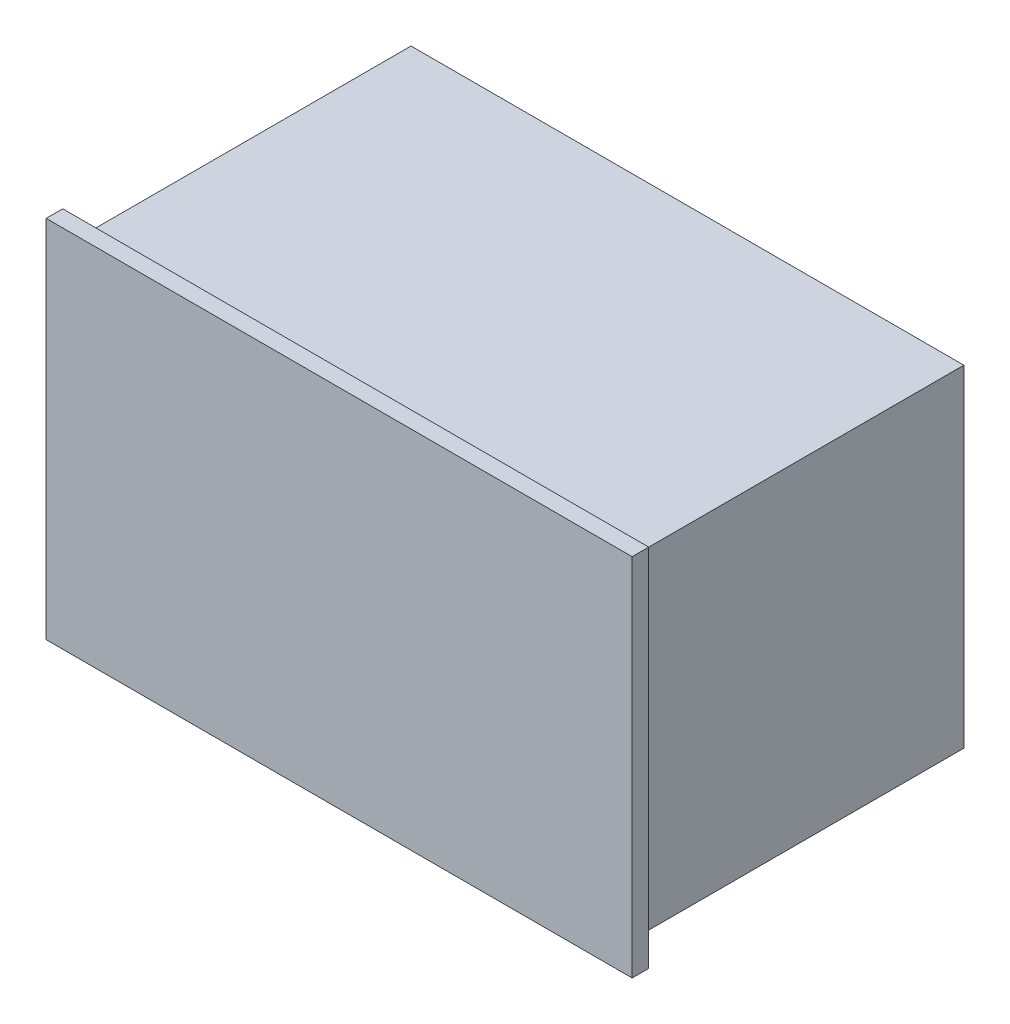
ISO-10303-21;
HEADER;
FILE_DESCRIPTION(('STEP AP214'),'2;1');
FILE_NAME('part.step','',(''),(''),'','','');
FILE_SCHEMA(('AUTOMOTIVE_DESIGN { 1 0 10303 214 1 1 1 1 }'));
ENDSEC;
DATA;
#1=APPLICATION_CONTEXT('core data for automotive mechanical design processes');
#2=APPLICATION_PROTOCOL_DEFINITION('international standard','automotive_design',2000,#1);
#3=PRODUCT_CONTEXT('',#1,'mechanical');
#4=PRODUCT('Part','Part','',(#3));
#5=PRODUCT_RELATED_PRODUCT_CATEGORY('part','',(#4));
#6=PRODUCT_DEFINITION_FORMATION('','',#4);
#7=PRODUCT_DEFINITION_CONTEXT('part definition',#1,'design');
#8=PRODUCT_DEFINITION('design','',#6,#7);
#9=PRODUCT_DEFINITION_SHAPE('','',#8);
#10=(LENGTH_UNIT() NAMED_UNIT(*) SI_UNIT(.MILLI.,.METRE.));
#11=(NAMED_UNIT(*) PLANE_ANGLE_UNIT() SI_UNIT($,.RADIAN.));
#12=(NAMED_UNIT(*) SI_UNIT($,.STERADIAN.) SOLID_ANGLE_UNIT());
#13=UNCERTAINTY_MEASURE_WITH_UNIT(LENGTH_MEASURE(1.E-05),#10,'distance_accuracy_value','');
#14=(GEOMETRIC_REPRESENTATION_CONTEXT(3) GLOBAL_UNCERTAINTY_ASSIGNED_CONTEXT((#13)) GLOBAL_UNIT_ASSIGNED_CONTEXT((#10,
#11,#12)) REPRESENTATION_CONTEXT('',''));
#15=CARTESIAN_POINT('',(0.,0.,0.));
#16=DIRECTION('',(0.,0.,1.));
#17=DIRECTION('',(1.,0.,0.));
#18=AXIS2_PLACEMENT_3D('',#15,#16,#17);
#19=CARTESIAN_POINT('',(0.,0.,60.));
#20=DIRECTION('',(1.,0.,0.));
#21=DIRECTION('',(0.,0.,-1.));
#22=AXIS2_PLACEMENT_3D('',#19,#20,#21);
#23=PLANE('',#22);
#24=DIRECTION('',(0.,-1.,0.));
#25=VECTOR('',#24,1.);
#26=CARTESIAN_POINT('',(0.,0.,0.));
#27=LINE('',#26,#25);
#28=CARTESIAN_POINT('',(0.,60.,0.));
#29=VERTEX_POINT('',#28);
#30=CARTESIAN_POINT('',(0.,0.,0.));
#31=VERTEX_POINT('',#30);
#32=EDGE_CURVE('E202',#29,#31,#27,.T.);
#33=ORIENTED_EDGE('',*,*,#32,.T.);
#34=DIRECTION('',(0.,0.,-1.));
#35=VECTOR('',#34,1.);
#36=CARTESIAN_POINT('',(0.,0.,60.));
#37=LINE('',#36,#35);
#38=CARTESIAN_POINT('',(0.,0.,60.));
#39=VERTEX_POINT('',#38);
#40=EDGE_CURVE('E11',#39,#31,#37,.T.);
#41=ORIENTED_EDGE('',*,*,#40,.F.);
#42=DIRECTION('',(0.,-1.,0.));
#43=VECTOR('',#42,1.);
#44=CARTESIAN_POINT('',(0.,0.,60.));
#45=LINE('',#44,#43);
#46=CARTESIAN_POINT('',(0.,60.,60.));
#47=VERTEX_POINT('',#46);
#48=EDGE_CURVE('E211',#47,#39,#45,.T.);
#49=ORIENTED_EDGE('',*,*,#48,.F.);
#50=DIRECTION('',(0.,0.,-1.));
#51=VECTOR('',#50,1.);
#52=CARTESIAN_POINT('',(0.,60.,60.));
#53=LINE('',#52,#51);
#54=EDGE_CURVE('E221',#47,#29,#53,.T.);
#55=ORIENTED_EDGE('',*,*,#54,.T.);
#56=EDGE_LOOP('',(#33,#41,#49,#55));
#57=FACE_BOUND('',#56,.T.);
#58=ADVANCED_FACE('F35',(#57),#23,.F.);
#59=CARTESIAN_POINT('',(0.,0.,60.));
#60=DIRECTION('',(0.,1.,0.));
#61=DIRECTION('',(0.,0.,1.));
#62=AXIS2_PLACEMENT_3D('',#59,#60,#61);
#63=PLANE('',#62);
#64=CARTESIAN_POINT('',(15.,0.,12.));
#65=DIRECTION('',(0.,-1.,0.));
#66=DIRECTION('',(0.,0.,-1.));
#67=AXIS2_PLACEMENT_3D('',#64,#65,#66);
#68=CIRCLE('',#67,5.5);
#69=CARTESIAN_POINT('',(15.,0.,6.5));
#70=VERTEX_POINT('',#69);
#71=EDGE_CURVE('E169',#70,#70,#68,.T.);
#72=ORIENTED_EDGE('',*,*,#71,.F.);
#73=EDGE_LOOP('',(#72));
#74=FACE_BOUND('',#73,.T.);
#75=CARTESIAN_POINT('',(30.,0.,12.));
#76=DIRECTION('',(0.,-1.,0.));
#77=DIRECTION('',(0.,0.,-1.));
#78=AXIS2_PLACEMENT_3D('',#75,#76,#77);
#79=CIRCLE('',#78,5.5);
#80=CARTESIAN_POINT('',(30.,0.,6.5));
#81=VERTEX_POINT('',#80);
#82=EDGE_CURVE('E160',#81,#81,#79,.T.);
#83=ORIENTED_EDGE('',*,*,#82,.F.);
#84=EDGE_LOOP('',(#83));
#85=FACE_BOUND('',#84,.T.);
#86=DIRECTION('',(1.,0.,0.));
#87=VECTOR('',#86,1.);
#88=CARTESIAN_POINT('',(0.,0.,0.));
#89=LINE('',#88,#87);
#90=CARTESIAN_POINT('',(100.,0.,0.));
#91=VERTEX_POINT('',#90);
#92=EDGE_CURVE('E224',#31,#91,#89,.T.);
#93=ORIENTED_EDGE('',*,*,#92,.T.);
#94=DIRECTION('',(0.,0.,-1.));
#95=VECTOR('',#94,1.);
#96=CARTESIAN_POINT('',(100.,0.,60.));
#97=LINE('',#96,#95);
#98=CARTESIAN_POINT('',(100.,0.,60.));
#99=VERTEX_POINT('',#98);
#100=EDGE_CURVE('E43',#99,#91,#97,.T.);
#101=ORIENTED_EDGE('',*,*,#100,.F.);
#102=DIRECTION('',(1.,0.,0.));
#103=VECTOR('',#102,1.);
#104=CARTESIAN_POINT('',(0.,0.,60.));
#105=LINE('',#104,#103);
#106=EDGE_CURVE('E77',#39,#99,#105,.T.);
#107=ORIENTED_EDGE('',*,*,#106,.F.);
#108=ORIENTED_EDGE('',*,*,#40,.T.);
#109=EDGE_LOOP('',(#93,#101,#107,#108));
#110=FACE_BOUND('',#109,.T.);
#111=ADVANCED_FACE('F269',(#74,#85,#110),#63,.F.);
#112=CARTESIAN_POINT('',(100.,0.,60.));
#113=DIRECTION('',(-1.,0.,0.));
#114=DIRECTION('',(0.,0.,1.));
#115=AXIS2_PLACEMENT_3D('',#112,#113,#114);
#116=PLANE('',#115);
#117=DIRECTION('',(0.,1.,0.));
#118=VECTOR('',#117,1.);
#119=CARTESIAN_POINT('',(100.,0.,0.));
#120=LINE('',#119,#118);
#121=CARTESIAN_POINT('',(100.,60.,0.));
#122=VERTEX_POINT('',#121);
#123=EDGE_CURVE('E67',#91,#122,#120,.T.);
#124=ORIENTED_EDGE('',*,*,#123,.T.);
#125=DIRECTION('',(0.,0.,-1.));
#126=VECTOR('',#125,1.);
#127=CARTESIAN_POINT('',(100.,60.,60.));
#128=LINE('',#127,#126);
#129=CARTESIAN_POINT('',(100.,60.,60.));
#130=VERTEX_POINT('',#129);
#131=EDGE_CURVE('E51',#130,#122,#128,.T.);
#132=ORIENTED_EDGE('',*,*,#131,.F.);
#133=DIRECTION('',(0.,1.,0.));
#134=VECTOR('',#133,1.);
#135=CARTESIAN_POINT('',(100.,0.,60.));
#136=LINE('',#135,#134);
#137=EDGE_CURVE('E215',#99,#130,#136,.T.);
#138=ORIENTED_EDGE('',*,*,#137,.F.);
#139=ORIENTED_EDGE('',*,*,#100,.T.);
#140=EDGE_LOOP('',(#124,#132,#138,#139));
#141=FACE_BOUND('',#140,.T.);
#142=ADVANCED_FACE('F229',(#141),#116,.F.);
#143=CARTESIAN_POINT('',(0.,60.,60.));
#144=DIRECTION('',(0.,-1.,0.));
#145=DIRECTION('',(0.,0.,-1.));
#146=AXIS2_PLACEMENT_3D('',#143,#144,#145);
#147=PLANE('',#146);
#148=DIRECTION('',(-1.,0.,0.));
#149=VECTOR('',#148,1.);
#150=CARTESIAN_POINT('',(0.,60.,0.));
#151=LINE('',#150,#149);
#152=EDGE_CURVE('E72',#122,#29,#151,.T.);
#153=ORIENTED_EDGE('',*,*,#152,.T.);
#154=ORIENTED_EDGE('',*,*,#54,.F.);
#155=DIRECTION('',(-1.,0.,0.));
#156=VECTOR('',#155,1.);
#157=CARTESIAN_POINT('',(0.,60.,60.));
#158=LINE('',#157,#156);
#159=EDGE_CURVE('E218',#130,#47,#158,.T.);
#160=ORIENTED_EDGE('',*,*,#159,.F.);
#161=ORIENTED_EDGE('',*,*,#131,.T.);
#162=EDGE_LOOP('',(#153,#154,#160,#161));
#163=FACE_BOUND('',#162,.T.);
#164=ADVANCED_FACE('F234',(#163),#147,.F.);
#165=CARTESIAN_POINT('',(0.,0.,0.));
#166=DIRECTION('',(0.,0.,-1.));
#167=DIRECTION('',(-1.,0.,0.));
#168=AXIS2_PLACEMENT_3D('',#165,#166,#167);
#169=PLANE('',#168);
#170=ORIENTED_EDGE('',*,*,#32,.F.);
#171=ORIENTED_EDGE('',*,*,#152,.F.);
#172=ORIENTED_EDGE('',*,*,#123,.F.);
#173=ORIENTED_EDGE('',*,*,#92,.F.);
#174=EDGE_LOOP('',(#170,#171,#172,#173));
#175=FACE_BOUND('',#174,.T.);
#176=ADVANCED_FACE('F232',(#175),#169,.T.);
#177=CARTESIAN_POINT('',(3.,3.,3.));
#178=DIRECTION('',(-1.,0.,0.));
#179=DIRECTION('',(0.,0.,1.));
#180=AXIS2_PLACEMENT_3D('',#177,#178,#179);
#181=PLANE('',#180);
#182=DIRECTION('',(0.,-1.,0.));
#183=VECTOR('',#182,1.);
#184=CARTESIAN_POINT('',(3.,3.,60.));
#185=LINE('',#184,#183);
#186=CARTESIAN_POINT('',(3.,57.,60.));
#187=VERTEX_POINT('',#186);
#188=CARTESIAN_POINT('',(3.,3.,60.));
#189=VERTEX_POINT('',#188);
#190=EDGE_CURVE('E171',#187,#189,#185,.T.);
#191=ORIENTED_EDGE('',*,*,#190,.T.);
#192=DIRECTION('',(0.,0.,1.));
#193=VECTOR('',#192,1.);
#194=CARTESIAN_POINT('',(3.,3.,3.));
#195=LINE('',#194,#193);
#196=CARTESIAN_POINT('',(3.,3.,3.));
#197=VERTEX_POINT('',#196);
#198=EDGE_CURVE('E188',#197,#189,#195,.T.);
#199=ORIENTED_EDGE('',*,*,#198,.F.);
#200=DIRECTION('',(0.,-1.,0.));
#201=VECTOR('',#200,1.);
#202=CARTESIAN_POINT('',(3.,3.,3.));
#203=LINE('',#202,#201);
#204=CARTESIAN_POINT('',(3.,57.,3.));
#205=VERTEX_POINT('',#204);
#206=EDGE_CURVE('E175',#205,#197,#203,.T.);
#207=ORIENTED_EDGE('',*,*,#206,.F.);
#208=DIRECTION('',(0.,0.,1.));
#209=VECTOR('',#208,1.);
#210=CARTESIAN_POINT('',(3.,57.,3.));
#211=LINE('',#210,#209);
#212=EDGE_CURVE('E199',#205,#187,#211,.T.);
#213=ORIENTED_EDGE('',*,*,#212,.T.);
#214=EDGE_LOOP('',(#191,#199,#207,#213));
#215=FACE_BOUND('',#214,.T.);
#216=ADVANCED_FACE('F285',(#215),#181,.F.);
#217=CARTESIAN_POINT('',(3.,57.,3.));
#218=DIRECTION('',(0.,1.,0.));
#219=DIRECTION('',(0.,0.,1.));
#220=AXIS2_PLACEMENT_3D('',#217,#218,#219);
#221=PLANE('',#220);
#222=DIRECTION('',(-1.,0.,0.));
#223=VECTOR('',#222,1.);
#224=CARTESIAN_POINT('',(3.,57.,60.));
#225=LINE('',#224,#223);
#226=CARTESIAN_POINT('',(97.,57.,60.));
#227=VERTEX_POINT('',#226);
#228=EDGE_CURVE('E179',#227,#187,#225,.T.);
#229=ORIENTED_EDGE('',*,*,#228,.T.);
#230=ORIENTED_EDGE('',*,*,#212,.F.);
#231=DIRECTION('',(-1.,0.,0.));
#232=VECTOR('',#231,1.);
#233=CARTESIAN_POINT('',(3.,57.,3.));
#234=LINE('',#233,#232);
#235=CARTESIAN_POINT('',(97.,57.,3.));
#236=VERTEX_POINT('',#235);
#237=EDGE_CURVE('E185',#236,#205,#234,.T.);
#238=ORIENTED_EDGE('',*,*,#237,.F.);
#239=DIRECTION('',(0.,0.,1.));
#240=VECTOR('',#239,1.);
#241=CARTESIAN_POINT('',(97.,57.,3.));
#242=LINE('',#241,#240);
#243=EDGE_CURVE('E203',#236,#227,#242,.T.);
#244=ORIENTED_EDGE('',*,*,#243,.T.);
#245=EDGE_LOOP('',(#229,#230,#238,#244));
#246=FACE_BOUND('',#245,.T.);
#247=ADVANCED_FACE('F288',(#246),#221,.F.);
#248=CARTESIAN_POINT('',(97.,3.,3.));
#249=DIRECTION('',(1.,0.,0.));
#250=DIRECTION('',(0.,0.,-1.));
#251=AXIS2_PLACEMENT_3D('',#248,#249,#250);
#252=PLANE('',#251);
#253=DIRECTION('',(0.,1.,0.));
#254=VECTOR('',#253,1.);
#255=CARTESIAN_POINT('',(97.,3.,60.));
#256=LINE('',#255,#254);
#257=CARTESIAN_POINT('',(97.,3.,60.));
#258=VERTEX_POINT('',#257);
#259=EDGE_CURVE('E194',#258,#227,#256,.T.);
#260=ORIENTED_EDGE('',*,*,#259,.T.);
#261=ORIENTED_EDGE('',*,*,#243,.F.);
#262=DIRECTION('',(0.,1.,0.));
#263=VECTOR('',#262,1.);
#264=CARTESIAN_POINT('',(97.,3.,3.));
#265=LINE('',#264,#263);
#266=CARTESIAN_POINT('',(97.,3.,3.));
#267=VERTEX_POINT('',#266);
#268=EDGE_CURVE('E182',#267,#236,#265,.T.);
#269=ORIENTED_EDGE('',*,*,#268,.F.);
#270=DIRECTION('',(0.,0.,1.));
#271=VECTOR('',#270,1.);
#272=CARTESIAN_POINT('',(97.,3.,3.));
#273=LINE('',#272,#271);
#274=EDGE_CURVE('E206',#267,#258,#273,.T.);
#275=ORIENTED_EDGE('',*,*,#274,.T.);
#276=EDGE_LOOP('',(#260,#261,#269,#275));
#277=FACE_BOUND('',#276,.T.);
#278=ADVANCED_FACE('F294',(#277),#252,.F.);
#279=CARTESIAN_POINT('',(3.,3.,3.));
#280=DIRECTION('',(0.,-1.,0.));
#281=DIRECTION('',(0.,0.,-1.));
#282=AXIS2_PLACEMENT_3D('',#279,#280,#281);
#283=PLANE('',#282);
#284=CARTESIAN_POINT('',(15.,3.,12.));
#285=DIRECTION('',(0.,-1.,0.));
#286=DIRECTION('',(0.,0.,-1.));
#287=AXIS2_PLACEMENT_3D('',#284,#285,#286);
#288=CIRCLE('',#287,5.5);
#289=CARTESIAN_POINT('',(15.,3.,6.5));
#290=VERTEX_POINT('',#289);
#291=EDGE_CURVE('E166',#290,#290,#288,.F.);
#292=ORIENTED_EDGE('',*,*,#291,.F.);
#293=EDGE_LOOP('',(#292));
#294=FACE_BOUND('',#293,.T.);
#295=CARTESIAN_POINT('',(30.,3.,12.));
#296=DIRECTION('',(0.,-1.,0.));
#297=DIRECTION('',(0.,0.,-1.));
#298=AXIS2_PLACEMENT_3D('',#295,#296,#297);
#299=CIRCLE('',#298,5.5);
#300=CARTESIAN_POINT('',(30.,3.,6.5));
#301=VERTEX_POINT('',#300);
#302=EDGE_CURVE('E157',#301,#301,#299,.F.);
#303=ORIENTED_EDGE('',*,*,#302,.F.);
#304=EDGE_LOOP('',(#303));
#305=FACE_BOUND('',#304,.T.);
#306=DIRECTION('',(1.,0.,0.));
#307=VECTOR('',#306,1.);
#308=CARTESIAN_POINT('',(3.,3.,60.));
#309=LINE('',#308,#307);
#310=EDGE_CURVE('E191',#189,#258,#309,.T.);
#311=ORIENTED_EDGE('',*,*,#310,.T.);
#312=ORIENTED_EDGE('',*,*,#274,.F.);
#313=DIRECTION('',(1.,0.,0.));
#314=VECTOR('',#313,1.);
#315=CARTESIAN_POINT('',(3.,3.,3.));
#316=LINE('',#315,#314);
#317=EDGE_CURVE('E178',#197,#267,#316,.T.);
#318=ORIENTED_EDGE('',*,*,#317,.F.);
#319=ORIENTED_EDGE('',*,*,#198,.T.);
#320=EDGE_LOOP('',(#311,#312,#318,#319));
#321=FACE_BOUND('',#320,.T.);
#322=ADVANCED_FACE('F290',(#294,#305,#321),#283,.F.);
#323=CARTESIAN_POINT('',(0.,0.,3.));
#324=DIRECTION('',(0.,0.,-1.));
#325=DIRECTION('',(-1.,0.,0.));
#326=AXIS2_PLACEMENT_3D('',#323,#324,#325);
#327=PLANE('',#326);
#328=ORIENTED_EDGE('',*,*,#206,.T.);
#329=ORIENTED_EDGE('',*,*,#317,.T.);
#330=ORIENTED_EDGE('',*,*,#268,.T.);
#331=ORIENTED_EDGE('',*,*,#237,.T.);
#332=EDGE_LOOP('',(#328,#329,#330,#331));
#333=FACE_BOUND('',#332,.T.);
#334=ADVANCED_FACE('F293',(#333),#327,.F.);
#335=CARTESIAN_POINT('',(30.,60.001,12.));
#336=DIRECTION('',(0.,-1.,0.));
#337=DIRECTION('',(0.,0.,-1.));
#338=AXIS2_PLACEMENT_3D('',#335,#336,#337);
#339=CYLINDRICAL_SURFACE('',#338,5.5);
#340=ORIENTED_EDGE('',*,*,#82,.T.);
#341=EDGE_LOOP('',(#340));
#342=FACE_BOUND('',#341,.T.);
#343=ORIENTED_EDGE('',*,*,#302,.T.);
#344=EDGE_LOOP('',(#343));
#345=FACE_BOUND('',#344,.T.);
#346=ADVANCED_FACE('F304',(#342,#345),#339,.F.);
#347=CARTESIAN_POINT('',(15.,60.001,12.));
#348=DIRECTION('',(0.,-1.,0.));
#349=DIRECTION('',(0.,0.,-1.));
#350=AXIS2_PLACEMENT_3D('',#347,#348,#349);
#351=CYLINDRICAL_SURFACE('',#350,5.5);
#352=ORIENTED_EDGE('',*,*,#71,.T.);
#353=EDGE_LOOP('',(#352));
#354=FACE_BOUND('',#353,.T.);
#355=ORIENTED_EDGE('',*,*,#291,.T.);
#356=EDGE_LOOP('',(#355));
#357=FACE_BOUND('',#356,.T.);
#358=ADVANCED_FACE('F239',(#354,#357),#351,.F.);
#359=CARTESIAN_POINT('',(0.,0.,60.));
#360=DIRECTION('',(0.,0.,-1.));
#361=DIRECTION('',(-1.,0.,0.));
#362=AXIS2_PLACEMENT_3D('',#359,#360,#361);
#363=PLANE('',#362);
#364=ORIENTED_EDGE('',*,*,#159,.T.);
#365=ORIENTED_EDGE('',*,*,#48,.T.);
#366=ORIENTED_EDGE('',*,*,#106,.T.);
#367=ORIENTED_EDGE('',*,*,#137,.T.);
#368=EDGE_LOOP('',(#364,#365,#366,#367));
#369=FACE_BOUND('',#368,.T.);
#370=DIRECTION('',(0.,-1.,0.));
#371=VECTOR('',#370,1.);
#372=CARTESIAN_POINT('',(-3.,-3.,60.));
#373=LINE('',#372,#371);
#374=CARTESIAN_POINT('',(-3.,63.,60.));
#375=VERTEX_POINT('',#374);
#376=CARTESIAN_POINT('',(-3.,-3.,60.));
#377=VERTEX_POINT('',#376);
#378=EDGE_CURVE('E156',#375,#377,#373,.T.);
#379=ORIENTED_EDGE('',*,*,#378,.F.);
#380=DIRECTION('',(-1.,0.,0.));
#381=VECTOR('',#380,1.);
#382=CARTESIAN_POINT('',(-3.,63.,60.));
#383=LINE('',#382,#381);
#384=CARTESIAN_POINT('',(103.,63.,60.));
#385=VERTEX_POINT('',#384);
#386=EDGE_CURVE('E152',#385,#375,#383,.T.);
#387=ORIENTED_EDGE('',*,*,#386,.F.);
#388=DIRECTION('',(0.,1.,0.));
#389=VECTOR('',#388,1.);
#390=CARTESIAN_POINT('',(103.,-3.,60.));
#391=LINE('',#390,#389);
#392=CARTESIAN_POINT('',(103.,-3.,60.));
#393=VERTEX_POINT('',#392);
#394=EDGE_CURVE('E246',#393,#385,#391,.T.);
#395=ORIENTED_EDGE('',*,*,#394,.F.);
#396=DIRECTION('',(1.,0.,0.));
#397=VECTOR('',#396,1.);
#398=CARTESIAN_POINT('',(-3.,-3.,60.));
#399=LINE('',#398,#397);
#400=EDGE_CURVE('E244',#377,#393,#399,.T.);
#401=ORIENTED_EDGE('',*,*,#400,.F.);
#402=EDGE_LOOP('',(#379,#387,#395,#401));
#403=FACE_BOUND('',#402,.T.);
#404=ADVANCED_FACE('F236',(#369,#403),#363,.T.);
#405=CARTESIAN_POINT('',(0.,0.,63.));
#406=DIRECTION('',(0.,0.,-1.));
#407=DIRECTION('',(-1.,0.,0.));
#408=AXIS2_PLACEMENT_3D('',#405,#406,#407);
#409=PLANE('',#408);
#410=DIRECTION('',(0.,-1.,0.));
#411=VECTOR('',#410,1.);
#412=CARTESIAN_POINT('',(-3.,-3.,63.));
#413=LINE('',#412,#411);
#414=CARTESIAN_POINT('',(-3.,63.,63.));
#415=VERTEX_POINT('',#414);
#416=CARTESIAN_POINT('',(-3.,-3.,63.));
#417=VERTEX_POINT('',#416);
#418=EDGE_CURVE('E143',#415,#417,#413,.T.);
#419=ORIENTED_EDGE('',*,*,#418,.T.);
#420=DIRECTION('',(1.,0.,0.));
#421=VECTOR('',#420,1.);
#422=CARTESIAN_POINT('',(-3.,-3.,63.));
#423=LINE('',#422,#421);
#424=CARTESIAN_POINT('',(103.,-3.,63.));
#425=VERTEX_POINT('',#424);
#426=EDGE_CURVE('E132',#417,#425,#423,.T.);
#427=ORIENTED_EDGE('',*,*,#426,.T.);
#428=DIRECTION('',(0.,1.,0.));
#429=VECTOR('',#428,1.);
#430=CARTESIAN_POINT('',(103.,-3.,63.));
#431=LINE('',#430,#429);
#432=CARTESIAN_POINT('',(103.,63.,63.));
#433=VERTEX_POINT('',#432);
#434=EDGE_CURVE('E142',#425,#433,#431,.T.);
#435=ORIENTED_EDGE('',*,*,#434,.T.);
#436=DIRECTION('',(-1.,0.,0.));
#437=VECTOR('',#436,1.);
#438=CARTESIAN_POINT('',(-3.,63.,63.));
#439=LINE('',#438,#437);
#440=EDGE_CURVE('E148',#433,#415,#439,.T.);
#441=ORIENTED_EDGE('',*,*,#440,.T.);
#442=EDGE_LOOP('',(#419,#427,#435,#441));
#443=FACE_BOUND('',#442,.T.);
#444=ADVANCED_FACE('F146',(#443),#409,.F.);
#445=CARTESIAN_POINT('',(-3.,63.,63.));
#446=DIRECTION('',(0.,-1.,0.));
#447=DIRECTION('',(0.,0.,-1.));
#448=AXIS2_PLACEMENT_3D('',#445,#446,#447);
#449=PLANE('',#448);
#450=ORIENTED_EDGE('',*,*,#386,.T.);
#451=DIRECTION('',(0.,0.,-1.));
#452=VECTOR('',#451,1.);
#453=CARTESIAN_POINT('',(-3.,63.,63.));
#454=LINE('',#453,#452);
#455=EDGE_CURVE('E253',#415,#375,#454,.T.);
#456=ORIENTED_EDGE('',*,*,#455,.F.);
#457=ORIENTED_EDGE('',*,*,#440,.F.);
#458=DIRECTION('',(0.,0.,-1.));
#459=VECTOR('',#458,1.);
#460=CARTESIAN_POINT('',(103.,63.,63.));
#461=LINE('',#460,#459);
#462=EDGE_CURVE('E162',#433,#385,#461,.T.);
#463=ORIENTED_EDGE('',*,*,#462,.T.);
#464=EDGE_LOOP('',(#450,#456,#457,#463));
#465=FACE_BOUND('',#464,.T.);
#466=ADVANCED_FACE('F257',(#465),#449,.F.);
#467=CARTESIAN_POINT('',(103.,-3.,63.));
#468=DIRECTION('',(-1.,0.,0.));
#469=DIRECTION('',(0.,0.,1.));
#470=AXIS2_PLACEMENT_3D('',#467,#468,#469);
#471=PLANE('',#470);
#472=ORIENTED_EDGE('',*,*,#394,.T.);
#473=ORIENTED_EDGE('',*,*,#462,.F.);
#474=ORIENTED_EDGE('',*,*,#434,.F.);
#475=DIRECTION('',(0.,0.,-1.));
#476=VECTOR('',#475,1.);
#477=CARTESIAN_POINT('',(103.,-3.,63.));
#478=LINE('',#477,#476);
#479=EDGE_CURVE('E139',#425,#393,#478,.T.);
#480=ORIENTED_EDGE('',*,*,#479,.T.);
#481=EDGE_LOOP('',(#472,#473,#474,#480));
#482=FACE_BOUND('',#481,.T.);
#483=ADVANCED_FACE('F259',(#482),#471,.F.);
#484=CARTESIAN_POINT('',(-3.,-3.,63.));
#485=DIRECTION('',(0.,1.,0.));
#486=DIRECTION('',(0.,0.,1.));
#487=AXIS2_PLACEMENT_3D('',#484,#485,#486);
#488=PLANE('',#487);
#489=ORIENTED_EDGE('',*,*,#400,.T.);
#490=ORIENTED_EDGE('',*,*,#479,.F.);
#491=ORIENTED_EDGE('',*,*,#426,.F.);
#492=DIRECTION('',(0.,0.,-1.));
#493=VECTOR('',#492,1.);
#494=CARTESIAN_POINT('',(-3.,-3.,63.));
#495=LINE('',#494,#493);
#496=EDGE_CURVE('E136',#417,#377,#495,.T.);
#497=ORIENTED_EDGE('',*,*,#496,.T.);
#498=EDGE_LOOP('',(#489,#490,#491,#497));
#499=FACE_BOUND('',#498,.T.);
#500=ADVANCED_FACE('F134',(#499),#488,.F.);
#501=CARTESIAN_POINT('',(-3.,-3.,63.));
#502=DIRECTION('',(1.,0.,0.));
#503=DIRECTION('',(0.,0.,-1.));
#504=AXIS2_PLACEMENT_3D('',#501,#502,#503);
#505=PLANE('',#504);
#506=ORIENTED_EDGE('',*,*,#378,.T.);
#507=ORIENTED_EDGE('',*,*,#496,.F.);
#508=ORIENTED_EDGE('',*,*,#418,.F.);
#509=ORIENTED_EDGE('',*,*,#455,.T.);
#510=EDGE_LOOP('',(#506,#507,#508,#509));
#511=FACE_BOUND('',#510,.T.);
#512=ADVANCED_FACE('F154',(#511),#505,.F.);
#513=ORIENTED_EDGE('',*,*,#310,.F.);
#514=ORIENTED_EDGE('',*,*,#190,.F.);
#515=ORIENTED_EDGE('',*,*,#228,.F.);
#516=ORIENTED_EDGE('',*,*,#259,.F.);
#517=EDGE_LOOP('',(#513,#514,#515,#516));
#518=FACE_BOUND('',#517,.T.);
#519=ADVANCED_FACE('F241',(#518),#363,.T.);
#520=CLOSED_SHELL('',(#58,#111,#142,#164,#176,#216,#247,#278,#322,#334,#346,#358,#404,#444,#466,
#483,#500,#512,#519));
#521=MANIFOLD_SOLID_BREP('B2',#520);
#522=ADVANCED_BREP_SHAPE_REPRESENTATION('',(#18,#521),#14);
#523=SHAPE_DEFINITION_REPRESENTATION(#9,#522);
ENDSEC;
END-ISO-10303-21;
